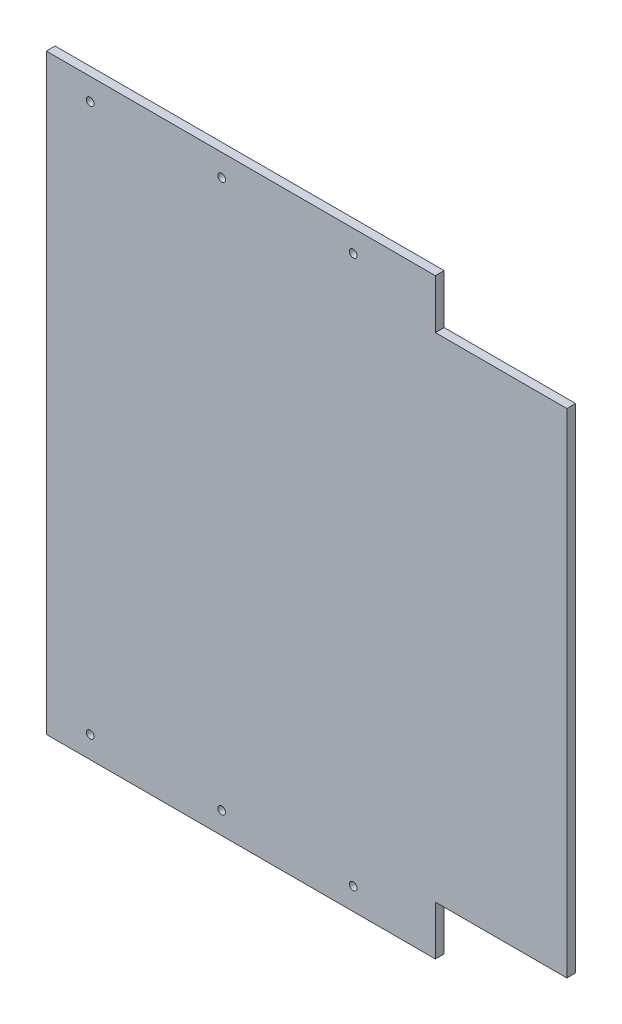
ISO-10303-21;
HEADER;
FILE_DESCRIPTION(('STEP AP214'),'2;1');
FILE_NAME('part.step','',(''),(''),'','','');
FILE_SCHEMA(('AUTOMOTIVE_DESIGN { 1 0 10303 214 1 1 1 1 }'));
ENDSEC;
DATA;
#1=APPLICATION_CONTEXT('core data for automotive mechanical design processes');
#2=APPLICATION_PROTOCOL_DEFINITION('international standard','automotive_design',2000,#1);
#3=PRODUCT_CONTEXT('',#1,'mechanical');
#4=PRODUCT('Part','Part','',(#3));
#5=PRODUCT_RELATED_PRODUCT_CATEGORY('part','',(#4));
#6=PRODUCT_DEFINITION_FORMATION('','',#4);
#7=PRODUCT_DEFINITION_CONTEXT('part definition',#1,'design');
#8=PRODUCT_DEFINITION('design','',#6,#7);
#9=PRODUCT_DEFINITION_SHAPE('','',#8);
#10=(LENGTH_UNIT() NAMED_UNIT(*) SI_UNIT(.MILLI.,.METRE.));
#11=(NAMED_UNIT(*) PLANE_ANGLE_UNIT() SI_UNIT($,.RADIAN.));
#12=(NAMED_UNIT(*) SI_UNIT($,.STERADIAN.) SOLID_ANGLE_UNIT());
#13=UNCERTAINTY_MEASURE_WITH_UNIT(LENGTH_MEASURE(1.E-05),#10,'distance_accuracy_value','');
#14=(GEOMETRIC_REPRESENTATION_CONTEXT(3) GLOBAL_UNCERTAINTY_ASSIGNED_CONTEXT((#13)) GLOBAL_UNIT_ASSIGNED_CONTEXT((#10,
#11,#12)) REPRESENTATION_CONTEXT('',''));
#15=CARTESIAN_POINT('',(0.,0.,0.));
#16=DIRECTION('',(0.,0.,1.));
#17=DIRECTION('',(1.,0.,0.));
#18=AXIS2_PLACEMENT_3D('',#15,#16,#17);
#19=CARTESIAN_POINT('',(0.,0.,8.));
#20=DIRECTION('',(1.,0.,0.));
#21=DIRECTION('',(0.,0.,-1.));
#22=AXIS2_PLACEMENT_3D('',#19,#20,#21);
#23=PLANE('',#22);
#24=DIRECTION('',(0.,-1.,0.));
#25=VECTOR('',#24,1.);
#26=CARTESIAN_POINT('',(0.,0.,0.));
#27=LINE('',#26,#25);
#28=CARTESIAN_POINT('',(0.,540.,0.));
#29=VERTEX_POINT('',#28);
#30=CARTESIAN_POINT('',(0.,0.,0.));
#31=VERTEX_POINT('',#30);
#32=EDGE_CURVE('E124',#29,#31,#27,.T.);
#33=ORIENTED_EDGE('',*,*,#32,.T.);
#34=DIRECTION('',(0.,0.,-1.));
#35=VECTOR('',#34,1.);
#36=CARTESIAN_POINT('',(0.,0.,8.));
#37=LINE('',#36,#35);
#38=CARTESIAN_POINT('',(0.,0.,8.));
#39=VERTEX_POINT('',#38);
#40=EDGE_CURVE('E11',#39,#31,#37,.T.);
#41=ORIENTED_EDGE('',*,*,#40,.F.);
#42=DIRECTION('',(0.,-1.,0.));
#43=VECTOR('',#42,1.);
#44=CARTESIAN_POINT('',(0.,0.,8.));
#45=LINE('',#44,#43);
#46=CARTESIAN_POINT('',(0.,540.,8.));
#47=VERTEX_POINT('',#46);
#48=EDGE_CURVE('E121',#47,#39,#45,.T.);
#49=ORIENTED_EDGE('',*,*,#48,.F.);
#50=DIRECTION('',(0.,0.,-1.));
#51=VECTOR('',#50,1.);
#52=CARTESIAN_POINT('',(0.,540.,8.));
#53=LINE('',#52,#51);
#54=EDGE_CURVE('E40',#47,#29,#53,.T.);
#55=ORIENTED_EDGE('',*,*,#54,.T.);
#56=EDGE_LOOP('',(#33,#41,#49,#55));
#57=FACE_BOUND('',#56,.T.);
#58=ADVANCED_FACE('F33',(#57),#23,.F.);
#59=CARTESIAN_POINT('',(0.,0.,8.));
#60=DIRECTION('',(0.,1.,0.));
#61=DIRECTION('',(0.,0.,1.));
#62=AXIS2_PLACEMENT_3D('',#59,#60,#61);
#63=PLANE('',#62);
#64=DIRECTION('',(1.,0.,0.));
#65=VECTOR('',#64,1.);
#66=CARTESIAN_POINT('',(0.,0.,0.));
#67=LINE('',#66,#65);
#68=CARTESIAN_POINT('',(355.,0.,0.));
#69=VERTEX_POINT('',#68);
#70=EDGE_CURVE('E119',#31,#69,#67,.T.);
#71=ORIENTED_EDGE('',*,*,#70,.T.);
#72=DIRECTION('',(0.,0.,1.));
#73=VECTOR('',#72,1.);
#74=CARTESIAN_POINT('',(355.,0.,0.));
#75=LINE('',#74,#73);
#76=CARTESIAN_POINT('',(355.,0.,8.));
#77=VERTEX_POINT('',#76);
#78=EDGE_CURVE('E161',#69,#77,#75,.T.);
#79=ORIENTED_EDGE('',*,*,#78,.T.);
#80=DIRECTION('',(1.,0.,0.));
#81=VECTOR('',#80,1.);
#82=CARTESIAN_POINT('',(0.,0.,8.));
#83=LINE('',#82,#81);
#84=EDGE_CURVE('E139',#39,#77,#83,.T.);
#85=ORIENTED_EDGE('',*,*,#84,.F.);
#86=ORIENTED_EDGE('',*,*,#40,.T.);
#87=EDGE_LOOP('',(#71,#79,#85,#86));
#88=FACE_BOUND('',#87,.T.);
#89=ADVANCED_FACE('F160',(#88),#63,.F.);
#90=CARTESIAN_POINT('',(475.,0.,8.));
#91=DIRECTION('',(-1.,0.,0.));
#92=DIRECTION('',(0.,0.,1.));
#93=AXIS2_PLACEMENT_3D('',#90,#91,#92);
#94=PLANE('',#93);
#95=DIRECTION('',(0.,1.,0.));
#96=VECTOR('',#95,1.);
#97=CARTESIAN_POINT('',(475.,0.,8.));
#98=LINE('',#97,#96);
#99=CARTESIAN_POINT('',(475.,45.,8.));
#100=VERTEX_POINT('',#99);
#101=CARTESIAN_POINT('',(475.,495.,8.));
#102=VERTEX_POINT('',#101);
#103=EDGE_CURVE('E113',#100,#102,#98,.T.);
#104=ORIENTED_EDGE('',*,*,#103,.F.);
#105=DIRECTION('',(0.,0.,1.));
#106=VECTOR('',#105,1.);
#107=CARTESIAN_POINT('',(475.,45.,0.));
#108=LINE('',#107,#106);
#109=CARTESIAN_POINT('',(475.,45.,0.));
#110=VERTEX_POINT('',#109);
#111=EDGE_CURVE('E102',#110,#100,#108,.T.);
#112=ORIENTED_EDGE('',*,*,#111,.F.);
#113=DIRECTION('',(0.,1.,0.));
#114=VECTOR('',#113,1.);
#115=CARTESIAN_POINT('',(475.,0.,0.));
#116=LINE('',#115,#114);
#117=CARTESIAN_POINT('',(475.,495.,0.));
#118=VERTEX_POINT('',#117);
#119=EDGE_CURVE('E112',#110,#118,#116,.T.);
#120=ORIENTED_EDGE('',*,*,#119,.T.);
#121=DIRECTION('',(0.,0.,1.));
#122=VECTOR('',#121,1.);
#123=CARTESIAN_POINT('',(475.,495.,0.));
#124=LINE('',#123,#122);
#125=EDGE_CURVE('E173',#118,#102,#124,.T.);
#126=ORIENTED_EDGE('',*,*,#125,.T.);
#127=EDGE_LOOP('',(#104,#112,#120,#126));
#128=FACE_BOUND('',#127,.T.);
#129=ADVANCED_FACE('F110',(#128),#94,.F.);
#130=CARTESIAN_POINT('',(0.,540.,8.));
#131=DIRECTION('',(0.,-1.,0.));
#132=DIRECTION('',(0.,0.,-1.));
#133=AXIS2_PLACEMENT_3D('',#130,#131,#132);
#134=PLANE('',#133);
#135=DIRECTION('',(-1.,0.,0.));
#136=VECTOR('',#135,1.);
#137=CARTESIAN_POINT('',(0.,540.,8.));
#138=LINE('',#137,#136);
#139=CARTESIAN_POINT('',(355.,540.,8.));
#140=VERTEX_POINT('',#139);
#141=EDGE_CURVE('E128',#140,#47,#138,.T.);
#142=ORIENTED_EDGE('',*,*,#141,.F.);
#143=DIRECTION('',(0.,0.,1.));
#144=VECTOR('',#143,1.);
#145=CARTESIAN_POINT('',(355.,540.,0.));
#146=LINE('',#145,#144);
#147=CARTESIAN_POINT('',(355.,540.,0.));
#148=VERTEX_POINT('',#147);
#149=EDGE_CURVE('E172',#148,#140,#146,.T.);
#150=ORIENTED_EDGE('',*,*,#149,.F.);
#151=DIRECTION('',(-1.,0.,0.));
#152=VECTOR('',#151,1.);
#153=CARTESIAN_POINT('',(0.,540.,0.));
#154=LINE('',#153,#152);
#155=EDGE_CURVE('E118',#148,#29,#154,.T.);
#156=ORIENTED_EDGE('',*,*,#155,.T.);
#157=ORIENTED_EDGE('',*,*,#54,.F.);
#158=EDGE_LOOP('',(#142,#150,#156,#157));
#159=FACE_BOUND('',#158,.T.);
#160=ADVANCED_FACE('F238',(#159),#134,.F.);
#161=CARTESIAN_POINT('',(0.,0.,8.));
#162=DIRECTION('',(0.,0.,-1.));
#163=DIRECTION('',(-1.,0.,0.));
#164=AXIS2_PLACEMENT_3D('',#161,#162,#163);
#165=PLANE('',#164);
#166=CARTESIAN_POINT('',(40.,520.,8.));
#167=DIRECTION('',(0.,0.,-1.));
#168=DIRECTION('',(-1.,0.,0.));
#169=AXIS2_PLACEMENT_3D('',#166,#167,#168);
#170=CIRCLE('',#169,3.50000000000001);
#171=CARTESIAN_POINT('',(36.5,520.,8.));
#172=VERTEX_POINT('',#171);
#173=EDGE_CURVE('E150',#172,#172,#170,.T.);
#174=ORIENTED_EDGE('',*,*,#173,.T.);
#175=EDGE_LOOP('',(#174));
#176=FACE_BOUND('',#175,.T.);
#177=CARTESIAN_POINT('',(280.,520.,8.));
#178=DIRECTION('',(0.,0.,-1.));
#179=DIRECTION('',(-1.,0.,0.));
#180=AXIS2_PLACEMENT_3D('',#177,#178,#179);
#181=CIRCLE('',#180,3.50000000000002);
#182=CARTESIAN_POINT('',(276.5,520.,8.));
#183=VERTEX_POINT('',#182);
#184=EDGE_CURVE('E207',#183,#183,#181,.T.);
#185=ORIENTED_EDGE('',*,*,#184,.T.);
#186=EDGE_LOOP('',(#185));
#187=FACE_BOUND('',#186,.T.);
#188=CARTESIAN_POINT('',(280.,20.,8.));
#189=DIRECTION('',(0.,0.,-1.));
#190=DIRECTION('',(-1.,0.,0.));
#191=AXIS2_PLACEMENT_3D('',#188,#189,#190);
#192=CIRCLE('',#191,3.50000000000002);
#193=CARTESIAN_POINT('',(276.5,20.,8.));
#194=VERTEX_POINT('',#193);
#195=EDGE_CURVE('E204',#194,#194,#192,.T.);
#196=ORIENTED_EDGE('',*,*,#195,.T.);
#197=EDGE_LOOP('',(#196));
#198=FACE_BOUND('',#197,.T.);
#199=CARTESIAN_POINT('',(40.,20.,8.));
#200=DIRECTION('',(0.,0.,-1.));
#201=DIRECTION('',(-1.,0.,0.));
#202=AXIS2_PLACEMENT_3D('',#199,#200,#201);
#203=CIRCLE('',#202,3.50000000000001);
#204=CARTESIAN_POINT('',(36.5,20.,8.));
#205=VERTEX_POINT('',#204);
#206=EDGE_CURVE('E201',#205,#205,#203,.T.);
#207=ORIENTED_EDGE('',*,*,#206,.T.);
#208=EDGE_LOOP('',(#207));
#209=FACE_BOUND('',#208,.T.);
#210=CARTESIAN_POINT('',(160.,19.9999999999999,8.));
#211=DIRECTION('',(0.,0.,-1.));
#212=DIRECTION('',(-1.,0.,0.));
#213=AXIS2_PLACEMENT_3D('',#210,#211,#212);
#214=CIRCLE('',#213,3.49999999999999);
#215=CARTESIAN_POINT('',(156.5,19.9999999999999,8.));
#216=VERTEX_POINT('',#215);
#217=EDGE_CURVE('E187',#216,#216,#214,.T.);
#218=ORIENTED_EDGE('',*,*,#217,.T.);
#219=EDGE_LOOP('',(#218));
#220=FACE_BOUND('',#219,.T.);
#221=CARTESIAN_POINT('',(160.,520.,8.));
#222=DIRECTION('',(0.,0.,-1.));
#223=DIRECTION('',(-1.,0.,0.));
#224=AXIS2_PLACEMENT_3D('',#221,#222,#223);
#225=CIRCLE('',#224,3.49999999999999);
#226=CARTESIAN_POINT('',(156.5,520.,8.));
#227=VERTEX_POINT('',#226);
#228=EDGE_CURVE('E142',#227,#227,#225,.T.);
#229=ORIENTED_EDGE('',*,*,#228,.T.);
#230=EDGE_LOOP('',(#229));
#231=FACE_BOUND('',#230,.T.);
#232=ORIENTED_EDGE('',*,*,#84,.T.);
#233=DIRECTION('',(0.,1.,0.));
#234=VECTOR('',#233,1.);
#235=CARTESIAN_POINT('',(355.,0.,8.));
#236=LINE('',#235,#234);
#237=CARTESIAN_POINT('',(355.,44.9999999999999,8.));
#238=VERTEX_POINT('',#237);
#239=EDGE_CURVE('E157',#77,#238,#236,.T.);
#240=ORIENTED_EDGE('',*,*,#239,.T.);
#241=DIRECTION('',(1.,0.,0.));
#242=VECTOR('',#241,1.);
#243=CARTESIAN_POINT('',(0.,44.9999999999998,8.));
#244=LINE('',#243,#242);
#245=EDGE_CURVE('E162',#238,#100,#244,.T.);
#246=ORIENTED_EDGE('',*,*,#245,.T.);
#247=ORIENTED_EDGE('',*,*,#103,.T.);
#248=DIRECTION('',(-1.,0.,0.));
#249=VECTOR('',#248,1.);
#250=CARTESIAN_POINT('',(0.,495.,8.));
#251=LINE('',#250,#249);
#252=CARTESIAN_POINT('',(355.,495.,8.));
#253=VERTEX_POINT('',#252);
#254=EDGE_CURVE('E180',#102,#253,#251,.T.);
#255=ORIENTED_EDGE('',*,*,#254,.T.);
#256=DIRECTION('',(0.,1.,0.));
#257=VECTOR('',#256,1.);
#258=CARTESIAN_POINT('',(355.,0.,8.));
#259=LINE('',#258,#257);
#260=EDGE_CURVE('E175',#253,#140,#259,.T.);
#261=ORIENTED_EDGE('',*,*,#260,.T.);
#262=ORIENTED_EDGE('',*,*,#141,.T.);
#263=ORIENTED_EDGE('',*,*,#48,.T.);
#264=EDGE_LOOP('',(#232,#240,#246,#247,#255,#261,#262,#263));
#265=FACE_BOUND('',#264,.T.);
#266=ADVANCED_FACE('F156',(#176,#187,#198,#209,#220,#231,#265),#165,.F.);
#267=CARTESIAN_POINT('',(0.,0.,0.));
#268=DIRECTION('',(0.,0.,-1.));
#269=DIRECTION('',(-1.,0.,0.));
#270=AXIS2_PLACEMENT_3D('',#267,#268,#269);
#271=PLANE('',#270);
#272=DIRECTION('',(0.,-1.,0.));
#273=VECTOR('',#272,1.);
#274=CARTESIAN_POINT('',(355.,0.,0.));
#275=LINE('',#274,#273);
#276=CARTESIAN_POINT('',(355.,44.9999999999999,0.));
#277=VERTEX_POINT('',#276);
#278=EDGE_CURVE('E47',#277,#69,#275,.T.);
#279=ORIENTED_EDGE('',*,*,#278,.T.);
#280=ORIENTED_EDGE('',*,*,#70,.F.);
#281=ORIENTED_EDGE('',*,*,#32,.F.);
#282=ORIENTED_EDGE('',*,*,#155,.F.);
#283=DIRECTION('',(0.,-1.,0.));
#284=VECTOR('',#283,1.);
#285=CARTESIAN_POINT('',(355.,540.,0.));
#286=LINE('',#285,#284);
#287=CARTESIAN_POINT('',(355.,495.,0.));
#288=VERTEX_POINT('',#287);
#289=EDGE_CURVE('E169',#148,#288,#286,.T.);
#290=ORIENTED_EDGE('',*,*,#289,.T.);
#291=DIRECTION('',(1.,0.,0.));
#292=VECTOR('',#291,1.);
#293=CARTESIAN_POINT('',(475.,495.,0.));
#294=LINE('',#293,#292);
#295=EDGE_CURVE('E55',#288,#118,#294,.T.);
#296=ORIENTED_EDGE('',*,*,#295,.T.);
#297=ORIENTED_EDGE('',*,*,#119,.F.);
#298=DIRECTION('',(-1.,0.,0.));
#299=VECTOR('',#298,1.);
#300=CARTESIAN_POINT('',(475.,45.,0.));
#301=LINE('',#300,#299);
#302=EDGE_CURVE('E99',#110,#277,#301,.T.);
#303=ORIENTED_EDGE('',*,*,#302,.T.);
#304=EDGE_LOOP('',(#279,#280,#281,#282,#290,#296,#297,#303));
#305=FACE_BOUND('',#304,.T.);
#306=CARTESIAN_POINT('',(40.,520.,0.));
#307=DIRECTION('',(0.,0.,1.));
#308=DIRECTION('',(1.,0.,0.));
#309=AXIS2_PLACEMENT_3D('',#306,#307,#308);
#310=CIRCLE('',#309,3.50000000000001);
#311=CARTESIAN_POINT('',(43.5,520.,0.));
#312=VERTEX_POINT('',#311);
#313=EDGE_CURVE('E184',#312,#312,#310,.T.);
#314=ORIENTED_EDGE('',*,*,#313,.T.);
#315=EDGE_LOOP('',(#314));
#316=FACE_BOUND('',#315,.T.);
#317=CARTESIAN_POINT('',(280.,520.,0.));
#318=DIRECTION('',(0.,0.,1.));
#319=DIRECTION('',(-1.,0.,0.));
#320=AXIS2_PLACEMENT_3D('',#317,#318,#319);
#321=CIRCLE('',#320,3.50000000000002);
#322=CARTESIAN_POINT('',(276.5,520.,0.));
#323=VERTEX_POINT('',#322);
#324=EDGE_CURVE('E188',#323,#323,#321,.T.);
#325=ORIENTED_EDGE('',*,*,#324,.T.);
#326=EDGE_LOOP('',(#325));
#327=FACE_BOUND('',#326,.T.);
#328=CARTESIAN_POINT('',(280.,20.,0.));
#329=DIRECTION('',(0.,0.,1.));
#330=DIRECTION('',(1.,0.,0.));
#331=AXIS2_PLACEMENT_3D('',#328,#329,#330);
#332=CIRCLE('',#331,3.50000000000002);
#333=CARTESIAN_POINT('',(283.5,20.,0.));
#334=VERTEX_POINT('',#333);
#335=EDGE_CURVE('E191',#334,#334,#332,.T.);
#336=ORIENTED_EDGE('',*,*,#335,.T.);
#337=EDGE_LOOP('',(#336));
#338=FACE_BOUND('',#337,.T.);
#339=CARTESIAN_POINT('',(40.,20.,0.));
#340=DIRECTION('',(0.,0.,1.));
#341=DIRECTION('',(-1.,0.,0.));
#342=AXIS2_PLACEMENT_3D('',#339,#340,#341);
#343=CIRCLE('',#342,3.50000000000001);
#344=CARTESIAN_POINT('',(36.5,20.,0.));
#345=VERTEX_POINT('',#344);
#346=EDGE_CURVE('E194',#345,#345,#343,.T.);
#347=ORIENTED_EDGE('',*,*,#346,.T.);
#348=EDGE_LOOP('',(#347));
#349=FACE_BOUND('',#348,.T.);
#350=CARTESIAN_POINT('',(160.,19.9999999999999,0.));
#351=DIRECTION('',(0.,0.,1.));
#352=DIRECTION('',(-1.,0.,0.));
#353=AXIS2_PLACEMENT_3D('',#350,#351,#352);
#354=CIRCLE('',#353,3.49999999999999);
#355=CARTESIAN_POINT('',(156.5,19.9999999999999,0.));
#356=VERTEX_POINT('',#355);
#357=EDGE_CURVE('E183',#356,#356,#354,.T.);
#358=ORIENTED_EDGE('',*,*,#357,.T.);
#359=EDGE_LOOP('',(#358));
#360=FACE_BOUND('',#359,.T.);
#361=CARTESIAN_POINT('',(160.,520.,0.));
#362=DIRECTION('',(0.,0.,1.));
#363=DIRECTION('',(1.,0.,0.));
#364=AXIS2_PLACEMENT_3D('',#361,#362,#363);
#365=CIRCLE('',#364,3.49999999999999);
#366=CARTESIAN_POINT('',(163.5,520.,0.));
#367=VERTEX_POINT('',#366);
#368=EDGE_CURVE('E145',#367,#367,#365,.T.);
#369=ORIENTED_EDGE('',*,*,#368,.T.);
#370=EDGE_LOOP('',(#369));
#371=FACE_BOUND('',#370,.T.);
#372=ADVANCED_FACE('F115',(#305,#316,#327,#338,#349,#360,#371),#271,.T.);
#373=CARTESIAN_POINT('',(160.,520.,0.));
#374=DIRECTION('',(0.,0.,1.));
#375=DIRECTION('',(1.,0.,0.));
#376=AXIS2_PLACEMENT_3D('',#373,#374,#375);
#377=CYLINDRICAL_SURFACE('',#376,3.49999999999999);
#378=ORIENTED_EDGE('',*,*,#368,.F.);
#379=EDGE_LOOP('',(#378));
#380=FACE_BOUND('',#379,.T.);
#381=ORIENTED_EDGE('',*,*,#228,.F.);
#382=EDGE_LOOP('',(#381));
#383=FACE_BOUND('',#382,.T.);
#384=ADVANCED_FACE('F246',(#380,#383),#377,.F.);
#385=CARTESIAN_POINT('',(160.,19.9999999999999,0.));
#386=DIRECTION('',(0.,0.,1.));
#387=DIRECTION('',(1.,0.,0.));
#388=AXIS2_PLACEMENT_3D('',#385,#386,#387);
#389=CYLINDRICAL_SURFACE('',#388,3.49999999999999);
#390=ORIENTED_EDGE('',*,*,#357,.F.);
#391=EDGE_LOOP('',(#390));
#392=FACE_BOUND('',#391,.T.);
#393=ORIENTED_EDGE('',*,*,#217,.F.);
#394=EDGE_LOOP('',(#393));
#395=FACE_BOUND('',#394,.T.);
#396=ADVANCED_FACE('F251',(#392,#395),#389,.F.);
#397=CARTESIAN_POINT('',(40.,20.,0.));
#398=DIRECTION('',(0.,0.,1.));
#399=DIRECTION('',(1.,0.,0.));
#400=AXIS2_PLACEMENT_3D('',#397,#398,#399);
#401=CYLINDRICAL_SURFACE('',#400,3.50000000000001);
#402=ORIENTED_EDGE('',*,*,#346,.F.);
#403=EDGE_LOOP('',(#402));
#404=FACE_BOUND('',#403,.T.);
#405=ORIENTED_EDGE('',*,*,#206,.F.);
#406=EDGE_LOOP('',(#405));
#407=FACE_BOUND('',#406,.T.);
#408=ADVANCED_FACE('F255',(#404,#407),#401,.F.);
#409=CARTESIAN_POINT('',(280.,20.,0.));
#410=DIRECTION('',(0.,0.,1.));
#411=DIRECTION('',(1.,0.,0.));
#412=AXIS2_PLACEMENT_3D('',#409,#410,#411);
#413=CYLINDRICAL_SURFACE('',#412,3.50000000000002);
#414=ORIENTED_EDGE('',*,*,#335,.F.);
#415=EDGE_LOOP('',(#414));
#416=FACE_BOUND('',#415,.T.);
#417=ORIENTED_EDGE('',*,*,#195,.F.);
#418=EDGE_LOOP('',(#417));
#419=FACE_BOUND('',#418,.T.);
#420=ADVANCED_FACE('F226',(#416,#419),#413,.F.);
#421=CARTESIAN_POINT('',(280.,520.,0.));
#422=DIRECTION('',(0.,0.,1.));
#423=DIRECTION('',(1.,0.,0.));
#424=AXIS2_PLACEMENT_3D('',#421,#422,#423);
#425=CYLINDRICAL_SURFACE('',#424,3.50000000000002);
#426=ORIENTED_EDGE('',*,*,#324,.F.);
#427=EDGE_LOOP('',(#426));
#428=FACE_BOUND('',#427,.T.);
#429=ORIENTED_EDGE('',*,*,#184,.F.);
#430=EDGE_LOOP('',(#429));
#431=FACE_BOUND('',#430,.T.);
#432=ADVANCED_FACE('F217',(#428,#431),#425,.F.);
#433=CARTESIAN_POINT('',(40.,520.,0.));
#434=DIRECTION('',(0.,0.,1.));
#435=DIRECTION('',(1.,0.,0.));
#436=AXIS2_PLACEMENT_3D('',#433,#434,#435);
#437=CYLINDRICAL_SURFACE('',#436,3.50000000000001);
#438=ORIENTED_EDGE('',*,*,#313,.F.);
#439=EDGE_LOOP('',(#438));
#440=FACE_BOUND('',#439,.T.);
#441=ORIENTED_EDGE('',*,*,#173,.F.);
#442=EDGE_LOOP('',(#441));
#443=FACE_BOUND('',#442,.T.);
#444=ADVANCED_FACE('F214',(#440,#443),#437,.F.);
#445=CARTESIAN_POINT('',(475.,495.,0.));
#446=DIRECTION('',(0.,-1.,0.));
#447=DIRECTION('',(0.,0.,-1.));
#448=AXIS2_PLACEMENT_3D('',#445,#446,#447);
#449=PLANE('',#448);
#450=ORIENTED_EDGE('',*,*,#125,.F.);
#451=ORIENTED_EDGE('',*,*,#295,.F.);
#452=DIRECTION('',(0.,0.,1.));
#453=VECTOR('',#452,1.);
#454=CARTESIAN_POINT('',(355.,495.,0.));
#455=LINE('',#454,#453);
#456=EDGE_CURVE('E176',#288,#253,#455,.T.);
#457=ORIENTED_EDGE('',*,*,#456,.T.);
#458=ORIENTED_EDGE('',*,*,#254,.F.);
#459=EDGE_LOOP('',(#450,#451,#457,#458));
#460=FACE_BOUND('',#459,.T.);
#461=ADVANCED_FACE('F216',(#460),#449,.F.);
#462=CARTESIAN_POINT('',(355.,540.,0.));
#463=DIRECTION('',(-1.,0.,0.));
#464=DIRECTION('',(0.,0.,1.));
#465=AXIS2_PLACEMENT_3D('',#462,#463,#464);
#466=PLANE('',#465);
#467=ORIENTED_EDGE('',*,*,#456,.F.);
#468=ORIENTED_EDGE('',*,*,#289,.F.);
#469=ORIENTED_EDGE('',*,*,#149,.T.);
#470=ORIENTED_EDGE('',*,*,#260,.F.);
#471=EDGE_LOOP('',(#467,#468,#469,#470));
#472=FACE_BOUND('',#471,.T.);
#473=ADVANCED_FACE('F224',(#472),#466,.F.);
#474=CARTESIAN_POINT('',(355.,0.,0.));
#475=DIRECTION('',(-1.,0.,0.));
#476=DIRECTION('',(0.,0.,1.));
#477=AXIS2_PLACEMENT_3D('',#474,#475,#476);
#478=PLANE('',#477);
#479=ORIENTED_EDGE('',*,*,#78,.F.);
#480=ORIENTED_EDGE('',*,*,#278,.F.);
#481=DIRECTION('',(0.,0.,1.));
#482=VECTOR('',#481,1.);
#483=CARTESIAN_POINT('',(355.,44.9999999999999,0.));
#484=LINE('',#483,#482);
#485=EDGE_CURVE('E104',#277,#238,#484,.T.);
#486=ORIENTED_EDGE('',*,*,#485,.T.);
#487=ORIENTED_EDGE('',*,*,#239,.F.);
#488=EDGE_LOOP('',(#479,#480,#486,#487));
#489=FACE_BOUND('',#488,.T.);
#490=ADVANCED_FACE('F337',(#489),#478,.F.);
#491=CARTESIAN_POINT('',(475.,45.,0.));
#492=DIRECTION('',(0.,1.,0.));
#493=DIRECTION('',(-1.,0.,0.));
#494=AXIS2_PLACEMENT_3D('',#491,#492,#493);
#495=PLANE('',#494);
#496=ORIENTED_EDGE('',*,*,#485,.F.);
#497=ORIENTED_EDGE('',*,*,#302,.F.);
#498=ORIENTED_EDGE('',*,*,#111,.T.);
#499=ORIENTED_EDGE('',*,*,#245,.F.);
#500=EDGE_LOOP('',(#496,#497,#498,#499));
#501=FACE_BOUND('',#500,.T.);
#502=ADVANCED_FACE('F101',(#501),#495,.F.);
#503=CLOSED_SHELL('',(#58,#89,#129,#160,#266,#372,#384,#396,#408,#420,#432,#444,#461,#473,#490,#502));
#504=MANIFOLD_SOLID_BREP('B2',#503);
#505=ADVANCED_BREP_SHAPE_REPRESENTATION('',(#18,#504),#14);
#506=SHAPE_DEFINITION_REPRESENTATION(#9,#505);
ENDSEC;
END-ISO-10303-21;
